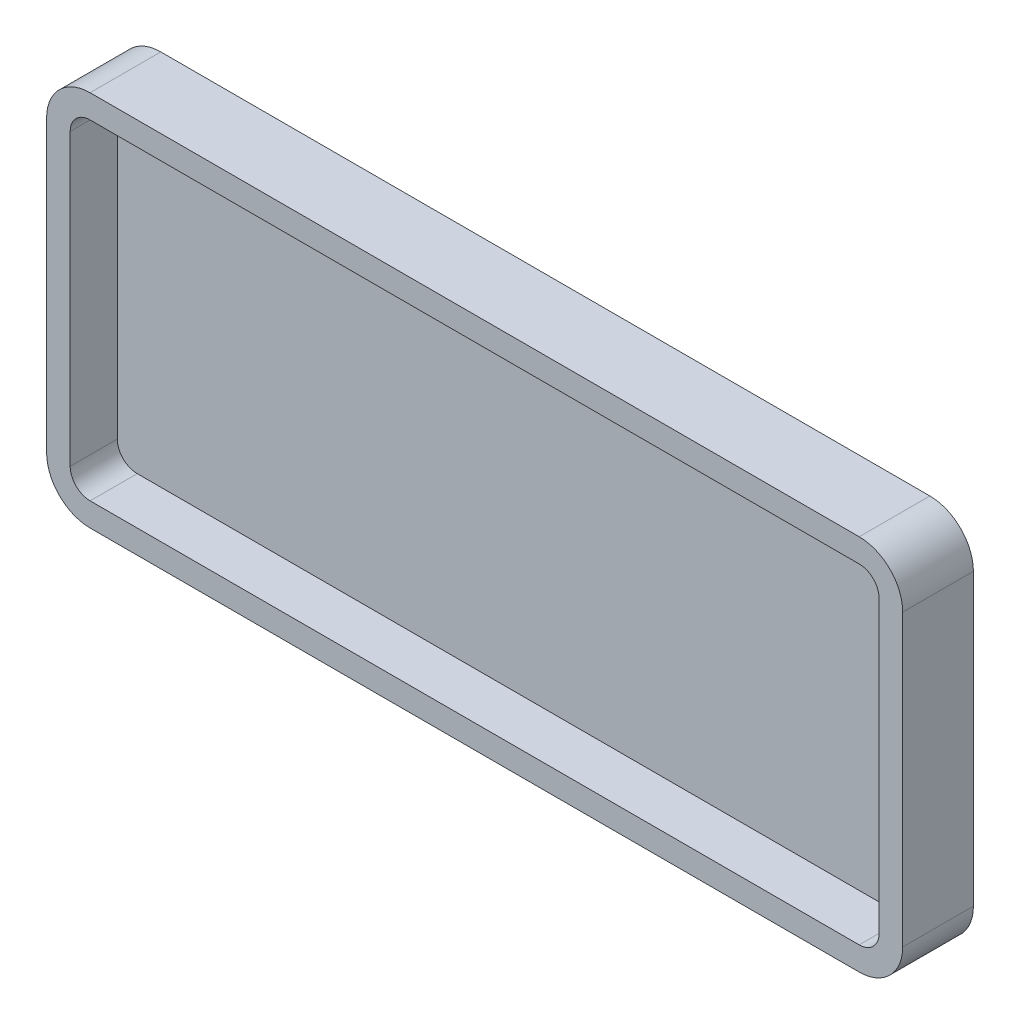
ISO-10303-21;
HEADER;
FILE_DESCRIPTION(('STEP AP214'),'2;1');
FILE_NAME('part.step','',(''),(''),'','','');
FILE_SCHEMA(('AUTOMOTIVE_DESIGN { 1 0 10303 214 1 1 1 1 }'));
ENDSEC;
DATA;
#1=APPLICATION_CONTEXT('core data for automotive mechanical design processes');
#2=APPLICATION_PROTOCOL_DEFINITION('international standard','automotive_design',2000,#1);
#3=PRODUCT_CONTEXT('',#1,'mechanical');
#4=PRODUCT('Part','Part','',(#3));
#5=PRODUCT_RELATED_PRODUCT_CATEGORY('part','',(#4));
#6=PRODUCT_DEFINITION_FORMATION('','',#4);
#7=PRODUCT_DEFINITION_CONTEXT('part definition',#1,'design');
#8=PRODUCT_DEFINITION('design','',#6,#7);
#9=PRODUCT_DEFINITION_SHAPE('','',#8);
#10=(LENGTH_UNIT() NAMED_UNIT(*) SI_UNIT(.MILLI.,.METRE.));
#11=(NAMED_UNIT(*) PLANE_ANGLE_UNIT() SI_UNIT($,.RADIAN.));
#12=(NAMED_UNIT(*) SI_UNIT($,.STERADIAN.) SOLID_ANGLE_UNIT());
#13=UNCERTAINTY_MEASURE_WITH_UNIT(LENGTH_MEASURE(1.E-05),#10,'distance_accuracy_value','');
#14=(GEOMETRIC_REPRESENTATION_CONTEXT(3) GLOBAL_UNCERTAINTY_ASSIGNED_CONTEXT((#13)) GLOBAL_UNIT_ASSIGNED_CONTEXT((#10,
#11,#12)) REPRESENTATION_CONTEXT('',''));
#15=CARTESIAN_POINT('',(0.,0.,0.));
#16=DIRECTION('',(0.,0.,1.));
#17=DIRECTION('',(1.,0.,0.));
#18=AXIS2_PLACEMENT_3D('',#15,#16,#17);
#19=CARTESIAN_POINT('',(24.48,-9.23,3.));
#20=DIRECTION('',(0.,0.,-1.));
#21=DIRECTION('',(-1.,0.,0.));
#22=AXIS2_PLACEMENT_3D('',#19,#20,#21);
#23=CYLINDRICAL_SURFACE('',#22,2.77);
#24=CARTESIAN_POINT('',(24.48,-9.23,-1.5));
#25=DIRECTION('',(0.,0.,1.));
#26=DIRECTION('',(1.,0.,0.));
#27=AXIS2_PLACEMENT_3D('',#24,#25,#26);
#28=CIRCLE('',#27,2.77);
#29=CARTESIAN_POINT('',(24.48,-12.,-1.5));
#30=VERTEX_POINT('',#29);
#31=CARTESIAN_POINT('',(27.25,-9.23,-1.5));
#32=VERTEX_POINT('',#31);
#33=EDGE_CURVE('E173',#30,#32,#28,.T.);
#34=ORIENTED_EDGE('',*,*,#33,.T.);
#35=DIRECTION('',(0.,0.,1.));
#36=VECTOR('',#35,1.);
#37=CARTESIAN_POINT('',(27.25,-9.23,3.));
#38=LINE('',#37,#36);
#39=CARTESIAN_POINT('',(27.25,-9.23,3.));
#40=VERTEX_POINT('',#39);
#41=EDGE_CURVE('E11',#40,#32,#38,.F.);
#42=ORIENTED_EDGE('',*,*,#41,.F.);
#43=CARTESIAN_POINT('',(24.48,-9.23,3.));
#44=DIRECTION('',(0.,0.,1.));
#45=DIRECTION('',(1.,0.,0.));
#46=AXIS2_PLACEMENT_3D('',#43,#44,#45);
#47=CIRCLE('',#46,2.77);
#48=CARTESIAN_POINT('',(24.48,-12.,3.));
#49=VERTEX_POINT('',#48);
#50=EDGE_CURVE('E260',#49,#40,#47,.T.);
#51=ORIENTED_EDGE('',*,*,#50,.F.);
#52=DIRECTION('',(0.,0.,-1.));
#53=VECTOR('',#52,1.);
#54=CARTESIAN_POINT('',(24.48,-12.,3.));
#55=LINE('',#54,#53);
#56=EDGE_CURVE('E226',#49,#30,#55,.T.);
#57=ORIENTED_EDGE('',*,*,#56,.T.);
#58=EDGE_LOOP('',(#34,#42,#51,#57));
#59=FACE_BOUND('',#58,.T.);
#60=ADVANCED_FACE('F37',(#59),#23,.T.);
#61=CARTESIAN_POINT('',(27.25,-9.23,3.));
#62=DIRECTION('',(-1.,0.,0.));
#63=DIRECTION('',(0.,-1.,0.));
#64=AXIS2_PLACEMENT_3D('',#61,#62,#63);
#65=PLANE('',#64);
#66=DIRECTION('',(0.,1.,0.));
#67=VECTOR('',#66,1.);
#68=CARTESIAN_POINT('',(27.25,-9.23,-1.5));
#69=LINE('',#68,#67);
#70=CARTESIAN_POINT('',(27.25,9.23,-1.5));
#71=VERTEX_POINT('',#70);
#72=EDGE_CURVE('E224',#32,#71,#69,.T.);
#73=ORIENTED_EDGE('',*,*,#72,.T.);
#74=DIRECTION('',(0.,0.,-1.));
#75=VECTOR('',#74,1.);
#76=CARTESIAN_POINT('',(27.25,9.23,3.));
#77=LINE('',#76,#75);
#78=CARTESIAN_POINT('',(27.25,9.23,3.));
#79=VERTEX_POINT('',#78);
#80=EDGE_CURVE('E46',#79,#71,#77,.T.);
#81=ORIENTED_EDGE('',*,*,#80,.F.);
#82=DIRECTION('',(0.,1.,0.));
#83=VECTOR('',#82,1.);
#84=CARTESIAN_POINT('',(27.25,-9.23,3.));
#85=LINE('',#84,#83);
#86=EDGE_CURVE('E262',#40,#79,#85,.T.);
#87=ORIENTED_EDGE('',*,*,#86,.F.);
#88=ORIENTED_EDGE('',*,*,#41,.T.);
#89=EDGE_LOOP('',(#73,#81,#87,#88));
#90=FACE_BOUND('',#89,.T.);
#91=ADVANCED_FACE('F291',(#90),#65,.F.);
#92=CARTESIAN_POINT('',(24.48,9.23,3.));
#93=DIRECTION('',(0.,0.,-1.));
#94=DIRECTION('',(-1.,0.,0.));
#95=AXIS2_PLACEMENT_3D('',#92,#93,#94);
#96=CYLINDRICAL_SURFACE('',#95,2.77);
#97=CARTESIAN_POINT('',(24.48,9.23,-1.5));
#98=DIRECTION('',(0.,0.,1.));
#99=DIRECTION('',(1.,0.,0.));
#100=AXIS2_PLACEMENT_3D('',#97,#98,#99);
#101=CIRCLE('',#100,2.77);
#102=CARTESIAN_POINT('',(24.48,12.,-1.5));
#103=VERTEX_POINT('',#102);
#104=EDGE_CURVE('E231',#71,#103,#101,.T.);
#105=ORIENTED_EDGE('',*,*,#104,.T.);
#106=DIRECTION('',(0.,0.,-1.));
#107=VECTOR('',#106,1.);
#108=CARTESIAN_POINT('',(24.48,12.,3.));
#109=LINE('',#108,#107);
#110=CARTESIAN_POINT('',(24.48,12.,3.));
#111=VERTEX_POINT('',#110);
#112=EDGE_CURVE('E234',#111,#103,#109,.T.);
#113=ORIENTED_EDGE('',*,*,#112,.F.);
#114=CARTESIAN_POINT('',(24.48,9.23,3.));
#115=DIRECTION('',(0.,0.,1.));
#116=DIRECTION('',(1.,0.,0.));
#117=AXIS2_PLACEMENT_3D('',#114,#115,#116);
#118=CIRCLE('',#117,2.77);
#119=EDGE_CURVE('E264',#79,#111,#118,.T.);
#120=ORIENTED_EDGE('',*,*,#119,.F.);
#121=ORIENTED_EDGE('',*,*,#80,.T.);
#122=EDGE_LOOP('',(#105,#113,#120,#121));
#123=FACE_BOUND('',#122,.T.);
#124=ADVANCED_FACE('F294',(#123),#96,.T.);
#125=CARTESIAN_POINT('',(-24.48,12.,3.));
#126=DIRECTION('',(0.,-1.,0.));
#127=DIRECTION('',(0.,0.,-1.));
#128=AXIS2_PLACEMENT_3D('',#125,#126,#127);
#129=PLANE('',#128);
#130=DIRECTION('',(-1.,0.,0.));
#131=VECTOR('',#130,1.);
#132=CARTESIAN_POINT('',(-24.48,12.,-1.5));
#133=LINE('',#132,#131);
#134=CARTESIAN_POINT('',(-24.48,12.,-1.5));
#135=VERTEX_POINT('',#134);
#136=EDGE_CURVE('E236',#103,#135,#133,.T.);
#137=ORIENTED_EDGE('',*,*,#136,.T.);
#138=DIRECTION('',(0.,0.,-1.));
#139=VECTOR('',#138,1.);
#140=CARTESIAN_POINT('',(-24.48,12.,3.));
#141=LINE('',#140,#139);
#142=CARTESIAN_POINT('',(-24.48,12.,3.));
#143=VERTEX_POINT('',#142);
#144=EDGE_CURVE('E239',#143,#135,#141,.T.);
#145=ORIENTED_EDGE('',*,*,#144,.F.);
#146=DIRECTION('',(-1.,0.,0.));
#147=VECTOR('',#146,1.);
#148=CARTESIAN_POINT('',(-24.48,12.,3.));
#149=LINE('',#148,#147);
#150=EDGE_CURVE('E266',#111,#143,#149,.T.);
#151=ORIENTED_EDGE('',*,*,#150,.F.);
#152=ORIENTED_EDGE('',*,*,#112,.T.);
#153=EDGE_LOOP('',(#137,#145,#151,#152));
#154=FACE_BOUND('',#153,.T.);
#155=ADVANCED_FACE('F299',(#154),#129,.F.);
#156=CARTESIAN_POINT('',(-24.48,9.23,3.));
#157=DIRECTION('',(0.,0.,-1.));
#158=DIRECTION('',(-1.,0.,0.));
#159=AXIS2_PLACEMENT_3D('',#156,#157,#158);
#160=CYLINDRICAL_SURFACE('',#159,2.77);
#161=CARTESIAN_POINT('',(-24.48,9.23,-1.5));
#162=DIRECTION('',(0.,0.,1.));
#163=DIRECTION('',(1.,0.,0.));
#164=AXIS2_PLACEMENT_3D('',#161,#162,#163);
#165=CIRCLE('',#164,2.77);
#166=CARTESIAN_POINT('',(-27.25,9.23,-1.5));
#167=VERTEX_POINT('',#166);
#168=EDGE_CURVE('E242',#135,#167,#165,.T.);
#169=ORIENTED_EDGE('',*,*,#168,.T.);
#170=DIRECTION('',(0.,0.,-1.));
#171=VECTOR('',#170,1.);
#172=CARTESIAN_POINT('',(-27.25,9.23,3.));
#173=LINE('',#172,#171);
#174=CARTESIAN_POINT('',(-27.25,9.23,3.));
#175=VERTEX_POINT('',#174);
#176=EDGE_CURVE('E245',#175,#167,#173,.T.);
#177=ORIENTED_EDGE('',*,*,#176,.F.);
#178=CARTESIAN_POINT('',(-24.48,9.23,3.));
#179=DIRECTION('',(0.,0.,1.));
#180=DIRECTION('',(1.,0.,0.));
#181=AXIS2_PLACEMENT_3D('',#178,#179,#180);
#182=CIRCLE('',#181,2.77);
#183=EDGE_CURVE('E268',#143,#175,#182,.T.);
#184=ORIENTED_EDGE('',*,*,#183,.F.);
#185=ORIENTED_EDGE('',*,*,#144,.T.);
#186=EDGE_LOOP('',(#169,#177,#184,#185));
#187=FACE_BOUND('',#186,.T.);
#188=ADVANCED_FACE('F303',(#187),#160,.T.);
#189=CARTESIAN_POINT('',(-27.25,-9.23,3.));
#190=DIRECTION('',(1.,0.,0.));
#191=DIRECTION('',(0.,0.,-1.));
#192=AXIS2_PLACEMENT_3D('',#189,#190,#191);
#193=PLANE('',#192);
#194=DIRECTION('',(0.,-1.,0.));
#195=VECTOR('',#194,1.);
#196=CARTESIAN_POINT('',(-27.25,-9.23,-1.5));
#197=LINE('',#196,#195);
#198=CARTESIAN_POINT('',(-27.25,-9.23,-1.5));
#199=VERTEX_POINT('',#198);
#200=EDGE_CURVE('E247',#167,#199,#197,.T.);
#201=ORIENTED_EDGE('',*,*,#200,.T.);
#202=DIRECTION('',(0.,0.,-1.));
#203=VECTOR('',#202,1.);
#204=CARTESIAN_POINT('',(-27.25,-9.23,3.));
#205=LINE('',#204,#203);
#206=CARTESIAN_POINT('',(-27.25,-9.23,3.));
#207=VERTEX_POINT('',#206);
#208=EDGE_CURVE('E250',#207,#199,#205,.T.);
#209=ORIENTED_EDGE('',*,*,#208,.F.);
#210=DIRECTION('',(0.,-1.,0.));
#211=VECTOR('',#210,1.);
#212=CARTESIAN_POINT('',(-27.25,-9.23,3.));
#213=LINE('',#212,#211);
#214=EDGE_CURVE('E270',#175,#207,#213,.T.);
#215=ORIENTED_EDGE('',*,*,#214,.F.);
#216=ORIENTED_EDGE('',*,*,#176,.T.);
#217=EDGE_LOOP('',(#201,#209,#215,#216));
#218=FACE_BOUND('',#217,.T.);
#219=ADVANCED_FACE('F307',(#218),#193,.F.);
#220=CARTESIAN_POINT('',(-24.48,-9.23,3.));
#221=DIRECTION('',(0.,0.,-1.));
#222=DIRECTION('',(-1.,0.,0.));
#223=AXIS2_PLACEMENT_3D('',#220,#221,#222);
#224=CYLINDRICAL_SURFACE('',#223,2.77);
#225=CARTESIAN_POINT('',(-24.48,-9.23,-1.5));
#226=DIRECTION('',(0.,0.,1.));
#227=DIRECTION('',(1.,0.,0.));
#228=AXIS2_PLACEMENT_3D('',#225,#226,#227);
#229=CIRCLE('',#228,2.77);
#230=CARTESIAN_POINT('',(-24.48,-12.,-1.5));
#231=VERTEX_POINT('',#230);
#232=EDGE_CURVE('E252',#199,#231,#229,.T.);
#233=ORIENTED_EDGE('',*,*,#232,.T.);
#234=DIRECTION('',(0.,0.,1.));
#235=VECTOR('',#234,1.);
#236=CARTESIAN_POINT('',(-24.48,-12.,3.));
#237=LINE('',#236,#235);
#238=CARTESIAN_POINT('',(-24.48,-12.,3.));
#239=VERTEX_POINT('',#238);
#240=EDGE_CURVE('E229',#239,#231,#237,.F.);
#241=ORIENTED_EDGE('',*,*,#240,.F.);
#242=CARTESIAN_POINT('',(-24.48,-9.23,3.));
#243=DIRECTION('',(0.,0.,1.));
#244=DIRECTION('',(1.,0.,0.));
#245=AXIS2_PLACEMENT_3D('',#242,#243,#244);
#246=CIRCLE('',#245,2.77);
#247=EDGE_CURVE('E271',#207,#239,#246,.T.);
#248=ORIENTED_EDGE('',*,*,#247,.F.);
#249=ORIENTED_EDGE('',*,*,#208,.T.);
#250=EDGE_LOOP('',(#233,#241,#248,#249));
#251=FACE_BOUND('',#250,.T.);
#252=ADVANCED_FACE('F278',(#251),#224,.T.);
#253=CARTESIAN_POINT('',(-24.48,-12.,3.));
#254=DIRECTION('',(0.,1.,0.));
#255=DIRECTION('',(0.,0.,1.));
#256=AXIS2_PLACEMENT_3D('',#253,#254,#255);
#257=PLANE('',#256);
#258=DIRECTION('',(1.,0.,0.));
#259=VECTOR('',#258,1.);
#260=CARTESIAN_POINT('',(-24.48,-12.,-1.5));
#261=LINE('',#260,#259);
#262=EDGE_CURVE('E256',#231,#30,#261,.T.);
#263=ORIENTED_EDGE('',*,*,#262,.T.);
#264=ORIENTED_EDGE('',*,*,#56,.F.);
#265=DIRECTION('',(1.,0.,0.));
#266=VECTOR('',#265,1.);
#267=CARTESIAN_POINT('',(-24.48,-12.,3.));
#268=LINE('',#267,#266);
#269=EDGE_CURVE('E41',#239,#49,#268,.T.);
#270=ORIENTED_EDGE('',*,*,#269,.F.);
#271=ORIENTED_EDGE('',*,*,#240,.T.);
#272=EDGE_LOOP('',(#263,#264,#270,#271));
#273=FACE_BOUND('',#272,.T.);
#274=ADVANCED_FACE('F282',(#273),#257,.F.);
#275=CARTESIAN_POINT('',(24.48,-9.23,3.));
#276=DIRECTION('',(0.,0.,1.));
#277=DIRECTION('',(1.,0.,0.));
#278=AXIS2_PLACEMENT_3D('',#275,#276,#277);
#279=PLANE('',#278);
#280=CARTESIAN_POINT('',(24.48,-9.23,3.));
#281=DIRECTION('',(0.,0.,1.));
#282=DIRECTION('',(1.,0.,0.));
#283=AXIS2_PLACEMENT_3D('',#280,#281,#282);
#284=CIRCLE('',#283,1.27);
#285=CARTESIAN_POINT('',(24.48,-10.5,3.));
#286=VERTEX_POINT('',#285);
#287=CARTESIAN_POINT('',(25.75,-9.23,3.));
#288=VERTEX_POINT('',#287);
#289=EDGE_CURVE('E154',#286,#288,#284,.T.);
#290=ORIENTED_EDGE('',*,*,#289,.F.);
#291=DIRECTION('',(1.,0.,0.));
#292=VECTOR('',#291,1.);
#293=CARTESIAN_POINT('',(-24.48,-10.5,3.));
#294=LINE('',#293,#292);
#295=CARTESIAN_POINT('',(-24.48,-10.5,3.));
#296=VERTEX_POINT('',#295);
#297=EDGE_CURVE('E191',#296,#286,#294,.T.);
#298=ORIENTED_EDGE('',*,*,#297,.F.);
#299=CARTESIAN_POINT('',(-24.48,-9.23,3.));
#300=DIRECTION('',(0.,0.,1.));
#301=DIRECTION('',(-1.,0.,0.));
#302=AXIS2_PLACEMENT_3D('',#299,#300,#301);
#303=CIRCLE('',#302,1.27);
#304=CARTESIAN_POINT('',(-25.75,-9.23,3.));
#305=VERTEX_POINT('',#304);
#306=EDGE_CURVE('E189',#305,#296,#303,.T.);
#307=ORIENTED_EDGE('',*,*,#306,.F.);
#308=DIRECTION('',(0.,-1.,0.));
#309=VECTOR('',#308,1.);
#310=CARTESIAN_POINT('',(-25.75,-9.23,3.));
#311=LINE('',#310,#309);
#312=CARTESIAN_POINT('',(-25.75,9.23,3.));
#313=VERTEX_POINT('',#312);
#314=EDGE_CURVE('E187',#313,#305,#311,.T.);
#315=ORIENTED_EDGE('',*,*,#314,.F.);
#316=CARTESIAN_POINT('',(-24.48,9.23,3.));
#317=DIRECTION('',(0.,0.,1.));
#318=DIRECTION('',(-1.,0.,0.));
#319=AXIS2_PLACEMENT_3D('',#316,#317,#318);
#320=CIRCLE('',#319,1.27);
#321=CARTESIAN_POINT('',(-24.48,10.5,3.));
#322=VERTEX_POINT('',#321);
#323=EDGE_CURVE('E185',#322,#313,#320,.T.);
#324=ORIENTED_EDGE('',*,*,#323,.F.);
#325=DIRECTION('',(-1.,0.,0.));
#326=VECTOR('',#325,1.);
#327=CARTESIAN_POINT('',(-24.48,10.5,3.));
#328=LINE('',#327,#326);
#329=CARTESIAN_POINT('',(24.48,10.5,3.));
#330=VERTEX_POINT('',#329);
#331=EDGE_CURVE('E181',#330,#322,#328,.T.);
#332=ORIENTED_EDGE('',*,*,#331,.F.);
#333=CARTESIAN_POINT('',(24.48,9.23,3.));
#334=DIRECTION('',(0.,0.,1.));
#335=DIRECTION('',(-1.,0.,0.));
#336=AXIS2_PLACEMENT_3D('',#333,#334,#335);
#337=CIRCLE('',#336,1.27);
#338=CARTESIAN_POINT('',(25.75,9.23,3.));
#339=VERTEX_POINT('',#338);
#340=EDGE_CURVE('E179',#339,#330,#337,.T.);
#341=ORIENTED_EDGE('',*,*,#340,.F.);
#342=DIRECTION('',(0.,1.,0.));
#343=VECTOR('',#342,1.);
#344=CARTESIAN_POINT('',(25.75,-9.23,3.));
#345=LINE('',#344,#343);
#346=EDGE_CURVE('E165',#288,#339,#345,.T.);
#347=ORIENTED_EDGE('',*,*,#346,.F.);
#348=EDGE_LOOP('',(#290,#298,#307,#315,#324,#332,#341,#347));
#349=FACE_BOUND('',#348,.T.);
#350=ORIENTED_EDGE('',*,*,#50,.T.);
#351=ORIENTED_EDGE('',*,*,#86,.T.);
#352=ORIENTED_EDGE('',*,*,#119,.T.);
#353=ORIENTED_EDGE('',*,*,#150,.T.);
#354=ORIENTED_EDGE('',*,*,#183,.T.);
#355=ORIENTED_EDGE('',*,*,#214,.T.);
#356=ORIENTED_EDGE('',*,*,#247,.T.);
#357=ORIENTED_EDGE('',*,*,#269,.T.);
#358=EDGE_LOOP('',(#350,#351,#352,#353,#354,#355,#356,#357));
#359=FACE_BOUND('',#358,.T.);
#360=ADVANCED_FACE('F177',(#349,#359),#279,.T.);
#361=CARTESIAN_POINT('',(24.48,-9.23,-1.5));
#362=DIRECTION('',(0.,0.,1.));
#363=DIRECTION('',(1.,0.,0.));
#364=AXIS2_PLACEMENT_3D('',#361,#362,#363);
#365=PLANE('',#364);
#366=ORIENTED_EDGE('',*,*,#33,.F.);
#367=ORIENTED_EDGE('',*,*,#262,.F.);
#368=ORIENTED_EDGE('',*,*,#232,.F.);
#369=ORIENTED_EDGE('',*,*,#200,.F.);
#370=ORIENTED_EDGE('',*,*,#168,.F.);
#371=ORIENTED_EDGE('',*,*,#136,.F.);
#372=ORIENTED_EDGE('',*,*,#104,.F.);
#373=ORIENTED_EDGE('',*,*,#72,.F.);
#374=EDGE_LOOP('',(#366,#367,#368,#369,#370,#371,#372,#373));
#375=FACE_BOUND('',#374,.T.);
#376=ADVANCED_FACE('F39',(#375),#365,.F.);
#377=CARTESIAN_POINT('',(24.48,-9.23,3.));
#378=DIRECTION('',(0.,0.,-1.));
#379=DIRECTION('',(-1.,0.,0.));
#380=AXIS2_PLACEMENT_3D('',#377,#378,#379);
#381=CYLINDRICAL_SURFACE('',#380,1.27);
#382=CARTESIAN_POINT('',(24.48,-9.23,0.));
#383=DIRECTION('',(0.,0.,1.));
#384=DIRECTION('',(1.,0.,0.));
#385=AXIS2_PLACEMENT_3D('',#382,#383,#384);
#386=CIRCLE('',#385,1.27);
#387=CARTESIAN_POINT('',(24.48,-10.5,0.));
#388=VERTEX_POINT('',#387);
#389=CARTESIAN_POINT('',(25.75,-9.23,0.));
#390=VERTEX_POINT('',#389);
#391=EDGE_CURVE('E194',#388,#390,#386,.T.);
#392=ORIENTED_EDGE('',*,*,#391,.F.);
#393=DIRECTION('',(0.,0.,-1.));
#394=VECTOR('',#393,1.);
#395=CARTESIAN_POINT('',(24.48,-10.5,3.));
#396=LINE('',#395,#394);
#397=EDGE_CURVE('E161',#286,#388,#396,.T.);
#398=ORIENTED_EDGE('',*,*,#397,.F.);
#399=ORIENTED_EDGE('',*,*,#289,.T.);
#400=DIRECTION('',(0.,0.,-1.));
#401=VECTOR('',#400,1.);
#402=CARTESIAN_POINT('',(25.75,-9.23,3.));
#403=LINE('',#402,#401);
#404=EDGE_CURVE('E158',#288,#390,#403,.T.);
#405=ORIENTED_EDGE('',*,*,#404,.T.);
#406=EDGE_LOOP('',(#392,#398,#399,#405));
#407=FACE_BOUND('',#406,.T.);
#408=ADVANCED_FACE('F157',(#407),#381,.F.);
#409=CARTESIAN_POINT('',(25.75,-9.23,3.));
#410=DIRECTION('',(-1.,0.,0.));
#411=DIRECTION('',(0.,-1.,0.));
#412=AXIS2_PLACEMENT_3D('',#409,#410,#411);
#413=PLANE('',#412);
#414=DIRECTION('',(0.,1.,0.));
#415=VECTOR('',#414,1.);
#416=CARTESIAN_POINT('',(25.75,-9.23,0.));
#417=LINE('',#416,#415);
#418=CARTESIAN_POINT('',(25.75,9.23,0.));
#419=VERTEX_POINT('',#418);
#420=EDGE_CURVE('E172',#390,#419,#417,.T.);
#421=ORIENTED_EDGE('',*,*,#420,.F.);
#422=ORIENTED_EDGE('',*,*,#404,.F.);
#423=ORIENTED_EDGE('',*,*,#346,.T.);
#424=DIRECTION('',(0.,0.,-1.));
#425=VECTOR('',#424,1.);
#426=CARTESIAN_POINT('',(25.75,9.23,3.));
#427=LINE('',#426,#425);
#428=EDGE_CURVE('E174',#339,#419,#427,.T.);
#429=ORIENTED_EDGE('',*,*,#428,.T.);
#430=EDGE_LOOP('',(#421,#422,#423,#429));
#431=FACE_BOUND('',#430,.T.);
#432=ADVANCED_FACE('F169',(#431),#413,.T.);
#433=CARTESIAN_POINT('',(24.48,9.23,3.));
#434=DIRECTION('',(0.,0.,-1.));
#435=DIRECTION('',(-1.,0.,0.));
#436=AXIS2_PLACEMENT_3D('',#433,#434,#435);
#437=CYLINDRICAL_SURFACE('',#436,1.27);
#438=CARTESIAN_POINT('',(24.48,9.23,0.));
#439=DIRECTION('',(0.,0.,1.));
#440=DIRECTION('',(-1.,0.,0.));
#441=AXIS2_PLACEMENT_3D('',#438,#439,#440);
#442=CIRCLE('',#441,1.27);
#443=CARTESIAN_POINT('',(24.48,10.5,0.));
#444=VERTEX_POINT('',#443);
#445=EDGE_CURVE('E197',#419,#444,#442,.T.);
#446=ORIENTED_EDGE('',*,*,#445,.F.);
#447=ORIENTED_EDGE('',*,*,#428,.F.);
#448=ORIENTED_EDGE('',*,*,#340,.T.);
#449=DIRECTION('',(0.,0.,-1.));
#450=VECTOR('',#449,1.);
#451=CARTESIAN_POINT('',(24.48,10.5,3.));
#452=LINE('',#451,#450);
#453=EDGE_CURVE('E219',#330,#444,#452,.T.);
#454=ORIENTED_EDGE('',*,*,#453,.T.);
#455=EDGE_LOOP('',(#446,#447,#448,#454));
#456=FACE_BOUND('',#455,.T.);
#457=ADVANCED_FACE('F362',(#456),#437,.F.);
#458=CARTESIAN_POINT('',(-24.48,10.5,3.));
#459=DIRECTION('',(0.,-1.,0.));
#460=DIRECTION('',(0.,0.,-1.));
#461=AXIS2_PLACEMENT_3D('',#458,#459,#460);
#462=PLANE('',#461);
#463=DIRECTION('',(-1.,0.,0.));
#464=VECTOR('',#463,1.);
#465=CARTESIAN_POINT('',(-24.48,10.5,0.));
#466=LINE('',#465,#464);
#467=CARTESIAN_POINT('',(-24.48,10.5,0.));
#468=VERTEX_POINT('',#467);
#469=EDGE_CURVE('E199',#444,#468,#466,.T.);
#470=ORIENTED_EDGE('',*,*,#469,.F.);
#471=ORIENTED_EDGE('',*,*,#453,.F.);
#472=ORIENTED_EDGE('',*,*,#331,.T.);
#473=DIRECTION('',(0.,0.,-1.));
#474=VECTOR('',#473,1.);
#475=CARTESIAN_POINT('',(-24.48,10.5,3.));
#476=LINE('',#475,#474);
#477=EDGE_CURVE('E216',#322,#468,#476,.T.);
#478=ORIENTED_EDGE('',*,*,#477,.T.);
#479=EDGE_LOOP('',(#470,#471,#472,#478));
#480=FACE_BOUND('',#479,.T.);
#481=ADVANCED_FACE('F371',(#480),#462,.T.);
#482=CARTESIAN_POINT('',(-24.48,9.23,3.));
#483=DIRECTION('',(0.,0.,-1.));
#484=DIRECTION('',(-1.,0.,0.));
#485=AXIS2_PLACEMENT_3D('',#482,#483,#484);
#486=CYLINDRICAL_SURFACE('',#485,1.27);
#487=CARTESIAN_POINT('',(-24.48,9.23,0.));
#488=DIRECTION('',(0.,0.,1.));
#489=DIRECTION('',(-1.,0.,0.));
#490=AXIS2_PLACEMENT_3D('',#487,#488,#489);
#491=CIRCLE('',#490,1.27);
#492=CARTESIAN_POINT('',(-25.75,9.23,0.));
#493=VERTEX_POINT('',#492);
#494=EDGE_CURVE('E201',#468,#493,#491,.T.);
#495=ORIENTED_EDGE('',*,*,#494,.F.);
#496=ORIENTED_EDGE('',*,*,#477,.F.);
#497=ORIENTED_EDGE('',*,*,#323,.T.);
#498=DIRECTION('',(0.,0.,-1.));
#499=VECTOR('',#498,1.);
#500=CARTESIAN_POINT('',(-25.75,9.23,3.));
#501=LINE('',#500,#499);
#502=EDGE_CURVE('E213',#313,#493,#501,.T.);
#503=ORIENTED_EDGE('',*,*,#502,.T.);
#504=EDGE_LOOP('',(#495,#496,#497,#503));
#505=FACE_BOUND('',#504,.T.);
#506=ADVANCED_FACE('F381',(#505),#486,.F.);
#507=CARTESIAN_POINT('',(-25.75,-9.23,3.));
#508=DIRECTION('',(1.,0.,0.));
#509=DIRECTION('',(0.,0.,-1.));
#510=AXIS2_PLACEMENT_3D('',#507,#508,#509);
#511=PLANE('',#510);
#512=DIRECTION('',(0.,-1.,0.));
#513=VECTOR('',#512,1.);
#514=CARTESIAN_POINT('',(-25.75,-9.23,0.));
#515=LINE('',#514,#513);
#516=CARTESIAN_POINT('',(-25.75,-9.23,0.));
#517=VERTEX_POINT('',#516);
#518=EDGE_CURVE('E203',#493,#517,#515,.T.);
#519=ORIENTED_EDGE('',*,*,#518,.F.);
#520=ORIENTED_EDGE('',*,*,#502,.F.);
#521=ORIENTED_EDGE('',*,*,#314,.T.);
#522=DIRECTION('',(0.,0.,-1.));
#523=VECTOR('',#522,1.);
#524=CARTESIAN_POINT('',(-25.75,-9.23,3.));
#525=LINE('',#524,#523);
#526=EDGE_CURVE('E210',#305,#517,#525,.T.);
#527=ORIENTED_EDGE('',*,*,#526,.T.);
#528=EDGE_LOOP('',(#519,#520,#521,#527));
#529=FACE_BOUND('',#528,.T.);
#530=ADVANCED_FACE('F391',(#529),#511,.T.);
#531=CARTESIAN_POINT('',(-24.48,-9.23,3.));
#532=DIRECTION('',(0.,0.,-1.));
#533=DIRECTION('',(-1.,0.,0.));
#534=AXIS2_PLACEMENT_3D('',#531,#532,#533);
#535=CYLINDRICAL_SURFACE('',#534,1.27);
#536=CARTESIAN_POINT('',(-24.48,-9.23,0.));
#537=DIRECTION('',(0.,0.,1.));
#538=DIRECTION('',(-1.,0.,0.));
#539=AXIS2_PLACEMENT_3D('',#536,#537,#538);
#540=CIRCLE('',#539,1.27);
#541=CARTESIAN_POINT('',(-24.48,-10.5,0.));
#542=VERTEX_POINT('',#541);
#543=EDGE_CURVE('E205',#517,#542,#540,.T.);
#544=ORIENTED_EDGE('',*,*,#543,.F.);
#545=ORIENTED_EDGE('',*,*,#526,.F.);
#546=ORIENTED_EDGE('',*,*,#306,.T.);
#547=DIRECTION('',(0.,0.,-1.));
#548=VECTOR('',#547,1.);
#549=CARTESIAN_POINT('',(-24.48,-10.5,3.));
#550=LINE('',#549,#548);
#551=EDGE_CURVE('E54',#296,#542,#550,.T.);
#552=ORIENTED_EDGE('',*,*,#551,.T.);
#553=EDGE_LOOP('',(#544,#545,#546,#552));
#554=FACE_BOUND('',#553,.T.);
#555=ADVANCED_FACE('F401',(#554),#535,.F.);
#556=CARTESIAN_POINT('',(-24.48,-10.5,3.));
#557=DIRECTION('',(0.,1.,0.));
#558=DIRECTION('',(0.,0.,1.));
#559=AXIS2_PLACEMENT_3D('',#556,#557,#558);
#560=PLANE('',#559);
#561=DIRECTION('',(1.,0.,0.));
#562=VECTOR('',#561,1.);
#563=CARTESIAN_POINT('',(-24.48,-10.5,0.));
#564=LINE('',#563,#562);
#565=EDGE_CURVE('E166',#542,#388,#564,.T.);
#566=ORIENTED_EDGE('',*,*,#565,.F.);
#567=ORIENTED_EDGE('',*,*,#551,.F.);
#568=ORIENTED_EDGE('',*,*,#297,.T.);
#569=ORIENTED_EDGE('',*,*,#397,.T.);
#570=EDGE_LOOP('',(#566,#567,#568,#569));
#571=FACE_BOUND('',#570,.T.);
#572=ADVANCED_FACE('F411',(#571),#560,.T.);
#573=CARTESIAN_POINT('',(24.48,-9.23,0.));
#574=DIRECTION('',(0.,0.,1.));
#575=DIRECTION('',(1.,0.,0.));
#576=AXIS2_PLACEMENT_3D('',#573,#574,#575);
#577=PLANE('',#576);
#578=ORIENTED_EDGE('',*,*,#391,.T.);
#579=ORIENTED_EDGE('',*,*,#420,.T.);
#580=ORIENTED_EDGE('',*,*,#445,.T.);
#581=ORIENTED_EDGE('',*,*,#469,.T.);
#582=ORIENTED_EDGE('',*,*,#494,.T.);
#583=ORIENTED_EDGE('',*,*,#518,.T.);
#584=ORIENTED_EDGE('',*,*,#543,.T.);
#585=ORIENTED_EDGE('',*,*,#565,.T.);
#586=EDGE_LOOP('',(#578,#579,#580,#581,#582,#583,#584,#585));
#587=FACE_BOUND('',#586,.T.);
#588=ADVANCED_FACE('F421',(#587),#577,.T.);
#589=CLOSED_SHELL('',(#60,#91,#124,#155,#188,#219,#252,#274,#360,#376,#408,#432,#457,#481,#506,
#530,#555,#572,#588));
#590=MANIFOLD_SOLID_BREP('B2',#589);
#591=ADVANCED_BREP_SHAPE_REPRESENTATION('',(#18,#590),#14);
#592=SHAPE_DEFINITION_REPRESENTATION(#9,#591);
ENDSEC;
END-ISO-10303-21;
